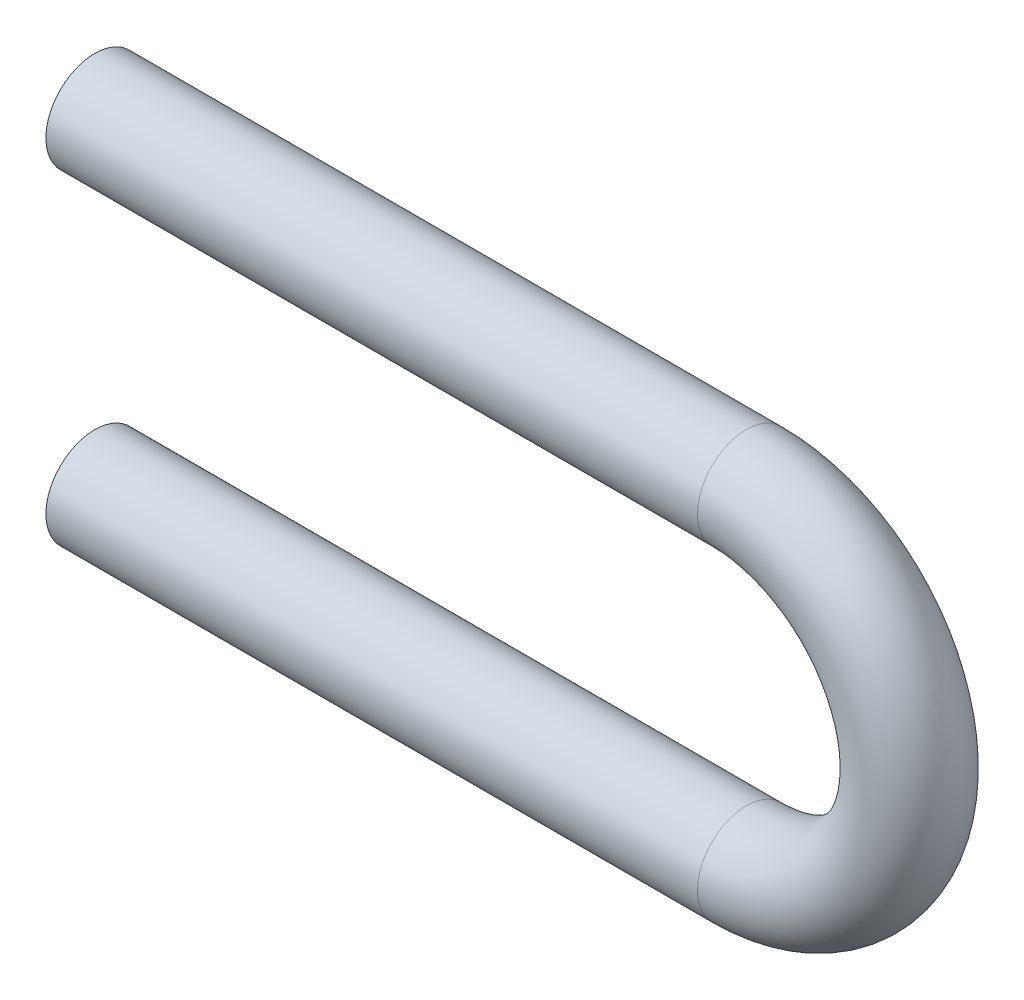
ISO-10303-21;
HEADER;
FILE_DESCRIPTION(('STEP AP214'),'2;1');
FILE_NAME('part.step','',(''),(''),'','','');
FILE_SCHEMA(('AUTOMOTIVE_DESIGN { 1 0 10303 214 1 1 1 1 }'));
ENDSEC;
DATA;
#1=APPLICATION_CONTEXT('core data for automotive mechanical design processes');
#2=APPLICATION_PROTOCOL_DEFINITION('international standard','automotive_design',2000,#1);
#3=PRODUCT_CONTEXT('',#1,'mechanical');
#4=PRODUCT('Part','Part','',(#3));
#5=PRODUCT_RELATED_PRODUCT_CATEGORY('part','',(#4));
#6=PRODUCT_DEFINITION_FORMATION('','',#4);
#7=PRODUCT_DEFINITION_CONTEXT('part definition',#1,'design');
#8=PRODUCT_DEFINITION('design','',#6,#7);
#9=PRODUCT_DEFINITION_SHAPE('','',#8);
#10=(LENGTH_UNIT() NAMED_UNIT(*) SI_UNIT(.MILLI.,.METRE.));
#11=(NAMED_UNIT(*) PLANE_ANGLE_UNIT() SI_UNIT($,.RADIAN.));
#12=(NAMED_UNIT(*) SI_UNIT($,.STERADIAN.) SOLID_ANGLE_UNIT());
#13=UNCERTAINTY_MEASURE_WITH_UNIT(LENGTH_MEASURE(1.E-05),#10,'distance_accuracy_value','');
#14=(GEOMETRIC_REPRESENTATION_CONTEXT(3) GLOBAL_UNCERTAINTY_ASSIGNED_CONTEXT((#13)) GLOBAL_UNIT_ASSIGNED_CONTEXT((#10,
#11,#12)) REPRESENTATION_CONTEXT('',''));
#15=CARTESIAN_POINT('',(0.,0.,0.));
#16=DIRECTION('',(0.,0.,1.));
#17=DIRECTION('',(1.,0.,0.));
#18=AXIS2_PLACEMENT_3D('',#15,#16,#17);
#19=CARTESIAN_POINT('',(0.,0.,0.));
#20=DIRECTION('',(1.,0.,0.));
#21=DIRECTION('',(0.,0.,-1.));
#22=AXIS2_PLACEMENT_3D('',#19,#20,#21);
#23=PLANE('',#22);
#24=CARTESIAN_POINT('',(0.,0.,0.));
#25=DIRECTION('',(1.,0.,0.));
#26=DIRECTION('',(0.,0.,-1.));
#27=AXIS2_PLACEMENT_3D('',#24,#25,#26);
#28=CIRCLE('',#27,3.);
#29=CARTESIAN_POINT('',(0.,0.,-3.));
#30=VERTEX_POINT('',#29);
#31=EDGE_CURVE('E60',#30,#30,#28,.T.);
#32=ORIENTED_EDGE('',*,*,#31,.F.);
#33=EDGE_LOOP('',(#32));
#34=FACE_BOUND('',#33,.T.);
#35=ADVANCED_FACE('F41',(#34),#23,.F.);
#36=CARTESIAN_POINT('',(0.,20.,0.));
#37=DIRECTION('',(-1.,0.,0.));
#38=DIRECTION('',(0.,0.,-1.));
#39=AXIS2_PLACEMENT_3D('',#36,#37,#38);
#40=PLANE('',#39);
#41=CARTESIAN_POINT('',(0.,20.,0.));
#42=DIRECTION('',(-1.,0.,0.));
#43=DIRECTION('',(0.,0.,-1.));
#44=AXIS2_PLACEMENT_3D('',#41,#42,#43);
#45=CIRCLE('',#44,3.);
#46=CARTESIAN_POINT('',(0.,20.,-3.));
#47=VERTEX_POINT('',#46);
#48=EDGE_CURVE('E10',#47,#47,#45,.T.);
#49=ORIENTED_EDGE('',*,*,#48,.T.);
#50=EDGE_LOOP('',(#49));
#51=FACE_BOUND('',#50,.T.);
#52=ADVANCED_FACE('F71',(#51),#40,.T.);
#53=CARTESIAN_POINT('',(0.,0.,0.));
#54=DIRECTION('',(1.,0.,0.));
#55=DIRECTION('',(0.,0.,-1.));
#56=AXIS2_PLACEMENT_3D('',#53,#54,#55);
#57=CYLINDRICAL_SURFACE('',#56,3.);
#58=CARTESIAN_POINT('',(40.,0.,0.));
#59=DIRECTION('',(1.,0.,0.));
#60=DIRECTION('',(0.,0.,-1.));
#61=AXIS2_PLACEMENT_3D('',#58,#59,#60);
#62=CIRCLE('',#61,3.);
#63=CARTESIAN_POINT('',(40.,-3.,0.));
#64=VERTEX_POINT('',#63);
#65=EDGE_CURVE('E54',#64,#64,#62,.T.);
#66=ORIENTED_EDGE('',*,*,#65,.F.);
#67=EDGE_LOOP('',(#66));
#68=FACE_BOUND('',#67,.T.);
#69=ORIENTED_EDGE('',*,*,#31,.T.);
#70=EDGE_LOOP('',(#69));
#71=FACE_BOUND('',#70,.T.);
#72=ADVANCED_FACE('F68',(#68,#71),#57,.T.);
#73=CARTESIAN_POINT('',(40.,10.,0.));
#74=DIRECTION('',(0.,0.,1.));
#75=DIRECTION('',(1.,0.,0.));
#76=AXIS2_PLACEMENT_3D('',#73,#74,#75);
#77=TOROIDAL_SURFACE('',#76,10.,3.);
#78=CARTESIAN_POINT('',(40.,20.,0.));
#79=DIRECTION('',(-1.,0.,0.));
#80=DIRECTION('',(0.,0.,-1.));
#81=AXIS2_PLACEMENT_3D('',#78,#79,#80);
#82=CIRCLE('',#81,3.);
#83=CARTESIAN_POINT('',(40.,23.,0.));
#84=VERTEX_POINT('',#83);
#85=EDGE_CURVE('E48',#84,#84,#82,.T.);
#86=CARTESIAN_POINT('',(40.,10.,0.));
#87=DIRECTION('',(0.,0.,1.));
#88=DIRECTION('',(1.,0.,0.));
#89=AXIS2_PLACEMENT_3D('',#86,#87,#88);
#90=CIRCLE('',#89,13.);
#91=EDGE_CURVE('',#64,#84,#90,.T.);
#92=ORIENTED_EDGE('',*,*,#65,.T.);
#93=ORIENTED_EDGE('',*,*,#85,.F.);
#94=ORIENTED_EDGE('',*,*,#91,.T.);
#95=ORIENTED_EDGE('',*,*,#91,.F.);
#96=EDGE_LOOP('',(#92,#94,#93,#95));
#97=FACE_BOUND('',#96,.T.);
#98=ADVANCED_FACE('F77',(#97),#77,.T.);
#99=CARTESIAN_POINT('',(40.,20.,0.));
#100=DIRECTION('',(-1.,0.,0.));
#101=DIRECTION('',(0.,-1.,0.));
#102=AXIS2_PLACEMENT_3D('',#99,#100,#101);
#103=CYLINDRICAL_SURFACE('',#102,3.);
#104=ORIENTED_EDGE('',*,*,#48,.F.);
#105=EDGE_LOOP('',(#104));
#106=FACE_BOUND('',#105,.T.);
#107=ORIENTED_EDGE('',*,*,#85,.T.);
#108=EDGE_LOOP('',(#107));
#109=FACE_BOUND('',#108,.T.);
#110=ADVANCED_FACE('F75',(#106,#109),#103,.T.);
#111=CLOSED_SHELL('',(#35,#52,#72,#98,#110));
#112=MANIFOLD_SOLID_BREP('B2',#111);
#113=ADVANCED_BREP_SHAPE_REPRESENTATION('',(#18,#112),#14);
#114=SHAPE_DEFINITION_REPRESENTATION(#9,#113);
ENDSEC;
END-ISO-10303-21;
